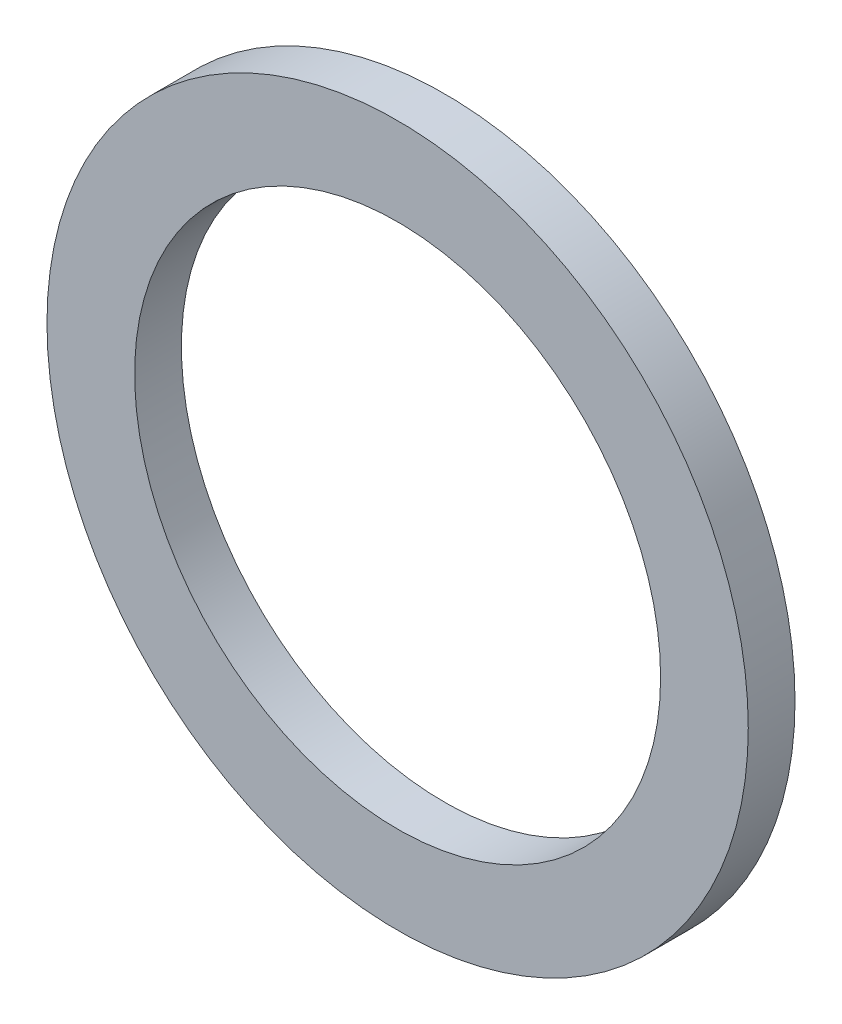
ISO-10303-21;
HEADER;
FILE_DESCRIPTION(('STEP AP214'),'2;1');
FILE_NAME('part.step','',(''),(''),'','','');
FILE_SCHEMA(('AUTOMOTIVE_DESIGN { 1 0 10303 214 1 1 1 1 }'));
ENDSEC;
DATA;
#1=APPLICATION_CONTEXT('core data for automotive mechanical design processes');
#2=APPLICATION_PROTOCOL_DEFINITION('international standard','automotive_design',2000,#1);
#3=PRODUCT_CONTEXT('',#1,'mechanical');
#4=PRODUCT('Part','Part','',(#3));
#5=PRODUCT_RELATED_PRODUCT_CATEGORY('part','',(#4));
#6=PRODUCT_DEFINITION_FORMATION('','',#4);
#7=PRODUCT_DEFINITION_CONTEXT('part definition',#1,'design');
#8=PRODUCT_DEFINITION('design','',#6,#7);
#9=PRODUCT_DEFINITION_SHAPE('','',#8);
#10=(LENGTH_UNIT() NAMED_UNIT(*) SI_UNIT(.MILLI.,.METRE.));
#11=(NAMED_UNIT(*) PLANE_ANGLE_UNIT() SI_UNIT($,.RADIAN.));
#12=(NAMED_UNIT(*) SI_UNIT($,.STERADIAN.) SOLID_ANGLE_UNIT());
#13=UNCERTAINTY_MEASURE_WITH_UNIT(LENGTH_MEASURE(1.E-05),#10,'distance_accuracy_value','');
#14=(GEOMETRIC_REPRESENTATION_CONTEXT(3) GLOBAL_UNCERTAINTY_ASSIGNED_CONTEXT((#13)) GLOBAL_UNIT_ASSIGNED_CONTEXT((#10,
#11,#12)) REPRESENTATION_CONTEXT('',''));
#15=CARTESIAN_POINT('',(0.,0.,0.));
#16=DIRECTION('',(0.,0.,1.));
#17=DIRECTION('',(1.,0.,0.));
#18=AXIS2_PLACEMENT_3D('',#15,#16,#17);
#19=CARTESIAN_POINT('',(0.,0.,0.4));
#20=DIRECTION('',(0.,0.,1.));
#21=DIRECTION('',(1.,0.,0.));
#22=AXIS2_PLACEMENT_3D('',#19,#20,#21);
#23=PLANE('',#22);
#24=CARTESIAN_POINT('',(0.,0.,0.4));
#25=DIRECTION('',(0.,0.,1.));
#26=DIRECTION('',(1.,0.,0.));
#27=AXIS2_PLACEMENT_3D('',#24,#25,#26);
#28=CIRCLE('',#27,3.);
#29=CARTESIAN_POINT('',(3.,0.,0.4));
#30=VERTEX_POINT('',#29);
#31=EDGE_CURVE('E10',#30,#30,#28,.T.);
#32=ORIENTED_EDGE('',*,*,#31,.T.);
#33=EDGE_LOOP('',(#32));
#34=FACE_BOUND('',#33,.T.);
#35=CARTESIAN_POINT('',(0.,0.,0.4));
#36=DIRECTION('',(0.,0.,1.));
#37=DIRECTION('',(1.,0.,0.));
#38=AXIS2_PLACEMENT_3D('',#35,#36,#37);
#39=CIRCLE('',#38,2.25);
#40=CARTESIAN_POINT('',(2.25,0.,0.4));
#41=VERTEX_POINT('',#40);
#42=EDGE_CURVE('E56',#41,#41,#39,.T.);
#43=ORIENTED_EDGE('',*,*,#42,.F.);
#44=EDGE_LOOP('',(#43));
#45=FACE_BOUND('',#44,.T.);
#46=ADVANCED_FACE('F43',(#34,#45),#23,.T.);
#47=CARTESIAN_POINT('',(0.,0.,0.));
#48=DIRECTION('',(0.,0.,1.));
#49=DIRECTION('',(1.,0.,0.));
#50=AXIS2_PLACEMENT_3D('',#47,#48,#49);
#51=PLANE('',#50);
#52=CARTESIAN_POINT('',(0.,0.,0.));
#53=DIRECTION('',(0.,0.,1.));
#54=DIRECTION('',(1.,0.,0.));
#55=AXIS2_PLACEMENT_3D('',#52,#53,#54);
#56=CIRCLE('',#55,3.);
#57=CARTESIAN_POINT('',(3.,0.,0.));
#58=VERTEX_POINT('',#57);
#59=EDGE_CURVE('E47',#58,#58,#56,.T.);
#60=ORIENTED_EDGE('',*,*,#59,.F.);
#61=EDGE_LOOP('',(#60));
#62=FACE_BOUND('',#61,.T.);
#63=CARTESIAN_POINT('',(0.,0.,0.));
#64=DIRECTION('',(0.,0.,1.));
#65=DIRECTION('',(1.,0.,0.));
#66=AXIS2_PLACEMENT_3D('',#63,#64,#65);
#67=CIRCLE('',#66,2.25);
#68=CARTESIAN_POINT('',(2.25,0.,0.));
#69=VERTEX_POINT('',#68);
#70=EDGE_CURVE('E58',#69,#69,#67,.T.);
#71=ORIENTED_EDGE('',*,*,#70,.T.);
#72=EDGE_LOOP('',(#71));
#73=FACE_BOUND('',#72,.T.);
#74=ADVANCED_FACE('F70',(#62,#73),#51,.F.);
#75=CARTESIAN_POINT('',(0.,0.,0.4));
#76=DIRECTION('',(0.,0.,-1.));
#77=DIRECTION('',(-1.,0.,0.));
#78=AXIS2_PLACEMENT_3D('',#75,#76,#77);
#79=CYLINDRICAL_SURFACE('',#78,3.);
#80=ORIENTED_EDGE('',*,*,#31,.F.);
#81=EDGE_LOOP('',(#80));
#82=FACE_BOUND('',#81,.T.);
#83=ORIENTED_EDGE('',*,*,#59,.T.);
#84=EDGE_LOOP('',(#83));
#85=FACE_BOUND('',#84,.T.);
#86=ADVANCED_FACE('F45',(#82,#85),#79,.T.);
#87=CARTESIAN_POINT('',(0.,0.,0.4));
#88=DIRECTION('',(0.,0.,-1.));
#89=DIRECTION('',(-1.,0.,0.));
#90=AXIS2_PLACEMENT_3D('',#87,#88,#89);
#91=CYLINDRICAL_SURFACE('',#90,2.25);
#92=ORIENTED_EDGE('',*,*,#42,.T.);
#93=EDGE_LOOP('',(#92));
#94=FACE_BOUND('',#93,.T.);
#95=ORIENTED_EDGE('',*,*,#70,.F.);
#96=EDGE_LOOP('',(#95));
#97=FACE_BOUND('',#96,.T.);
#98=ADVANCED_FACE('F66',(#94,#97),#91,.F.);
#99=CLOSED_SHELL('',(#46,#74,#86,#98));
#100=MANIFOLD_SOLID_BREP('B2',#99);
#101=ADVANCED_BREP_SHAPE_REPRESENTATION('',(#18,#100),#14);
#102=SHAPE_DEFINITION_REPRESENTATION(#9,#101);
ENDSEC;
END-ISO-10303-21;
